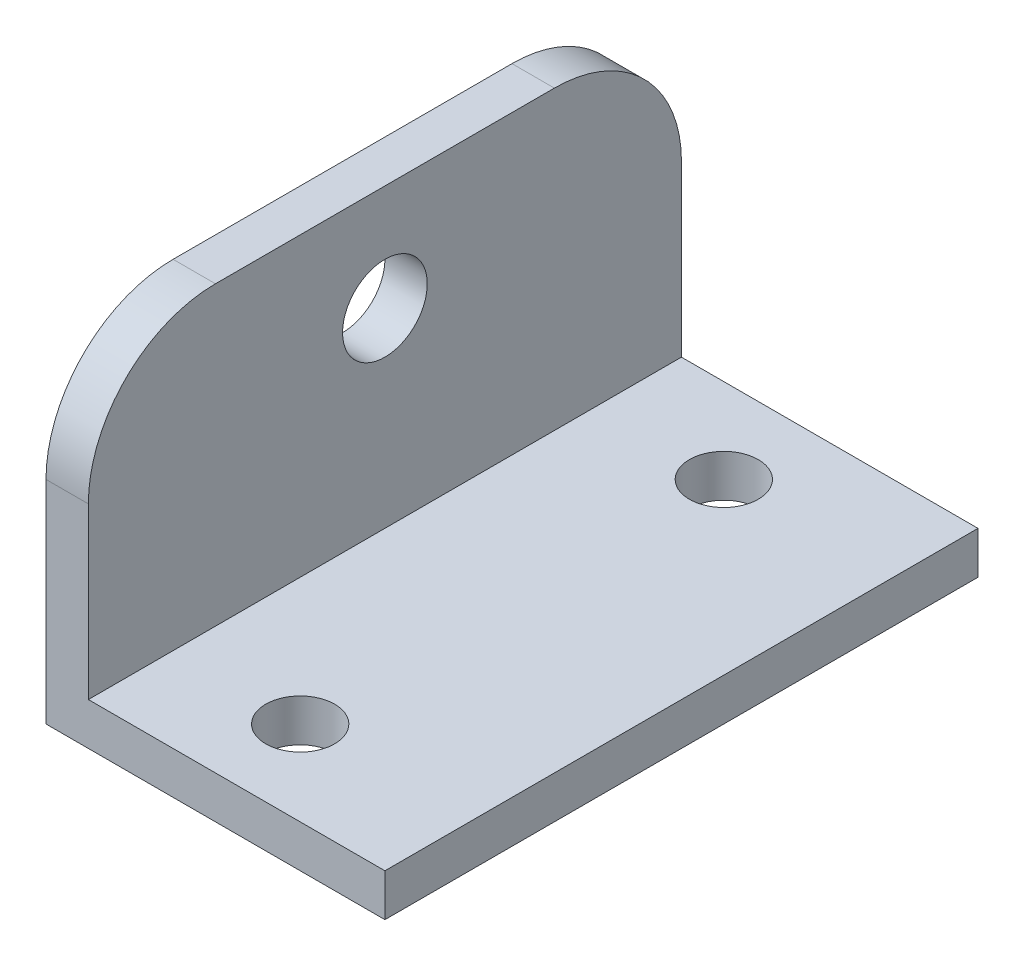
ISO-10303-21;
HEADER;
FILE_DESCRIPTION(('STEP AP214'),'2;1');
FILE_NAME('part.step','',(''),(''),'','','');
FILE_SCHEMA(('AUTOMOTIVE_DESIGN { 1 0 10303 214 1 1 1 1 }'));
ENDSEC;
DATA;
#1=APPLICATION_CONTEXT('core data for automotive mechanical design processes');
#2=APPLICATION_PROTOCOL_DEFINITION('international standard','automotive_design',2000,#1);
#3=PRODUCT_CONTEXT('',#1,'mechanical');
#4=PRODUCT('Part','Part','',(#3));
#5=PRODUCT_RELATED_PRODUCT_CATEGORY('part','',(#4));
#6=PRODUCT_DEFINITION_FORMATION('','',#4);
#7=PRODUCT_DEFINITION_CONTEXT('part definition',#1,'design');
#8=PRODUCT_DEFINITION('design','',#6,#7);
#9=PRODUCT_DEFINITION_SHAPE('','',#8);
#10=(LENGTH_UNIT() NAMED_UNIT(*) SI_UNIT(.MILLI.,.METRE.));
#11=(NAMED_UNIT(*) PLANE_ANGLE_UNIT() SI_UNIT($,.RADIAN.));
#12=(NAMED_UNIT(*) SI_UNIT($,.STERADIAN.) SOLID_ANGLE_UNIT());
#13=UNCERTAINTY_MEASURE_WITH_UNIT(LENGTH_MEASURE(1.E-05),#10,'distance_accuracy_value','');
#14=(GEOMETRIC_REPRESENTATION_CONTEXT(3) GLOBAL_UNCERTAINTY_ASSIGNED_CONTEXT((#13)) GLOBAL_UNIT_ASSIGNED_CONTEXT((#10,
#11,#12)) REPRESENTATION_CONTEXT('',''));
#15=CARTESIAN_POINT('',(0.,0.,0.));
#16=DIRECTION('',(0.,0.,1.));
#17=DIRECTION('',(1.,0.,0.));
#18=AXIS2_PLACEMENT_3D('',#15,#16,#17);
#19=CARTESIAN_POINT('',(0.,0.,44.45));
#20=DIRECTION('',(0.,1.,0.));
#21=DIRECTION('',(0.,0.,1.));
#22=AXIS2_PLACEMENT_3D('',#19,#20,#21);
#23=PLANE('',#22);
#24=CARTESIAN_POINT('',(12.7,0.,38.1));
#25=DIRECTION('',(0.,-1.,0.));
#26=DIRECTION('',(0.,0.,-1.));
#27=AXIS2_PLACEMENT_3D('',#24,#25,#26);
#28=CIRCLE('',#27,2.5796875);
#29=CARTESIAN_POINT('',(12.7,0.,35.5203125));
#30=VERTEX_POINT('',#29);
#31=EDGE_CURVE('E195',#30,#30,#28,.T.);
#32=ORIENTED_EDGE('',*,*,#31,.F.);
#33=EDGE_LOOP('',(#32));
#34=FACE_BOUND('',#33,.T.);
#35=CARTESIAN_POINT('',(12.7,0.,6.35));
#36=DIRECTION('',(0.,-1.,0.));
#37=DIRECTION('',(0.,0.,-1.));
#38=AXIS2_PLACEMENT_3D('',#35,#36,#37);
#39=CIRCLE('',#38,2.5796875);
#40=CARTESIAN_POINT('',(12.7,0.,3.7703125));
#41=VERTEX_POINT('',#40);
#42=EDGE_CURVE('E189',#41,#41,#39,.T.);
#43=ORIENTED_EDGE('',*,*,#42,.F.);
#44=EDGE_LOOP('',(#43));
#45=FACE_BOUND('',#44,.T.);
#46=DIRECTION('',(1.,0.,0.));
#47=VECTOR('',#46,1.);
#48=CARTESIAN_POINT('',(0.,0.,0.));
#49=LINE('',#48,#47);
#50=CARTESIAN_POINT('',(0.,0.,0.));
#51=VERTEX_POINT('',#50);
#52=CARTESIAN_POINT('',(25.4,0.,0.));
#53=VERTEX_POINT('',#52);
#54=EDGE_CURVE('E127',#51,#53,#49,.T.);
#55=ORIENTED_EDGE('',*,*,#54,.T.);
#56=DIRECTION('',(0.,0.,-1.));
#57=VECTOR('',#56,1.);
#58=CARTESIAN_POINT('',(25.4,0.,44.45));
#59=LINE('',#58,#57);
#60=CARTESIAN_POINT('',(25.4,0.,44.45));
#61=VERTEX_POINT('',#60);
#62=EDGE_CURVE('E108',#61,#53,#59,.T.);
#63=ORIENTED_EDGE('',*,*,#62,.F.);
#64=DIRECTION('',(1.,0.,0.));
#65=VECTOR('',#64,1.);
#66=CARTESIAN_POINT('',(0.,0.,44.45));
#67=LINE('',#66,#65);
#68=CARTESIAN_POINT('',(0.,0.,44.45));
#69=VERTEX_POINT('',#68);
#70=EDGE_CURVE('E115',#69,#61,#67,.T.);
#71=ORIENTED_EDGE('',*,*,#70,.F.);
#72=DIRECTION('',(0.,0.,-1.));
#73=VECTOR('',#72,1.);
#74=CARTESIAN_POINT('',(0.,0.,44.45));
#75=LINE('',#74,#73);
#76=EDGE_CURVE('E167',#69,#51,#75,.T.);
#77=ORIENTED_EDGE('',*,*,#76,.T.);
#78=EDGE_LOOP('',(#55,#63,#71,#77));
#79=FACE_BOUND('',#78,.T.);
#80=ADVANCED_FACE('F35',(#34,#45,#79),#23,.F.);
#81=CARTESIAN_POINT('',(25.4,0.,44.45));
#82=DIRECTION('',(-1.,0.,0.));
#83=DIRECTION('',(0.,0.,1.));
#84=AXIS2_PLACEMENT_3D('',#81,#82,#83);
#85=PLANE('',#84);
#86=DIRECTION('',(0.,1.,0.));
#87=VECTOR('',#86,1.);
#88=CARTESIAN_POINT('',(25.4,0.,0.));
#89=LINE('',#88,#87);
#90=CARTESIAN_POINT('',(25.4,3.175,0.));
#91=VERTEX_POINT('',#90);
#92=EDGE_CURVE('E173',#53,#91,#89,.T.);
#93=ORIENTED_EDGE('',*,*,#92,.T.);
#94=DIRECTION('',(0.,0.,-1.));
#95=VECTOR('',#94,1.);
#96=CARTESIAN_POINT('',(25.4,3.175,44.45));
#97=LINE('',#96,#95);
#98=CARTESIAN_POINT('',(25.4,3.175,44.45));
#99=VERTEX_POINT('',#98);
#100=EDGE_CURVE('E111',#99,#91,#97,.T.);
#101=ORIENTED_EDGE('',*,*,#100,.F.);
#102=DIRECTION('',(0.,1.,0.));
#103=VECTOR('',#102,1.);
#104=CARTESIAN_POINT('',(25.4,0.,44.45));
#105=LINE('',#104,#103);
#106=EDGE_CURVE('E104',#61,#99,#105,.T.);
#107=ORIENTED_EDGE('',*,*,#106,.F.);
#108=ORIENTED_EDGE('',*,*,#62,.T.);
#109=EDGE_LOOP('',(#93,#101,#107,#108));
#110=FACE_BOUND('',#109,.T.);
#111=ADVANCED_FACE('F106',(#110),#85,.F.);
#112=CARTESIAN_POINT('',(3.175,3.175,44.45));
#113=DIRECTION('',(0.,-1.,0.));
#114=DIRECTION('',(0.,0.,-1.));
#115=AXIS2_PLACEMENT_3D('',#112,#113,#114);
#116=PLANE('',#115);
#117=CARTESIAN_POINT('',(12.7,3.175,38.1));
#118=DIRECTION('',(0.,-1.,0.));
#119=DIRECTION('',(0.,0.,-1.));
#120=AXIS2_PLACEMENT_3D('',#117,#118,#119);
#121=CIRCLE('',#120,2.5796875);
#122=CARTESIAN_POINT('',(12.7,3.175,35.5203125));
#123=VERTEX_POINT('',#122);
#124=EDGE_CURVE('E192',#123,#123,#121,.T.);
#125=ORIENTED_EDGE('',*,*,#124,.T.);
#126=EDGE_LOOP('',(#125));
#127=FACE_BOUND('',#126,.T.);
#128=CARTESIAN_POINT('',(12.7,3.175,6.35));
#129=DIRECTION('',(0.,-1.,0.));
#130=DIRECTION('',(0.,0.,-1.));
#131=AXIS2_PLACEMENT_3D('',#128,#129,#130);
#132=CIRCLE('',#131,2.5796875);
#133=CARTESIAN_POINT('',(12.7,3.175,3.7703125));
#134=VERTEX_POINT('',#133);
#135=EDGE_CURVE('E186',#134,#134,#132,.T.);
#136=ORIENTED_EDGE('',*,*,#135,.T.);
#137=EDGE_LOOP('',(#136));
#138=FACE_BOUND('',#137,.T.);
#139=DIRECTION('',(-1.,0.,0.));
#140=VECTOR('',#139,1.);
#141=CARTESIAN_POINT('',(3.175,3.175,0.));
#142=LINE('',#141,#140);
#143=CARTESIAN_POINT('',(3.175,3.175,0.));
#144=VERTEX_POINT('',#143);
#145=EDGE_CURVE('E163',#91,#144,#142,.T.);
#146=ORIENTED_EDGE('',*,*,#145,.T.);
#147=DIRECTION('',(0.,0.,-1.));
#148=VECTOR('',#147,1.);
#149=CARTESIAN_POINT('',(3.175,3.175,44.45));
#150=LINE('',#149,#148);
#151=CARTESIAN_POINT('',(3.175,3.175,44.45));
#152=VERTEX_POINT('',#151);
#153=EDGE_CURVE('E132',#152,#144,#150,.T.);
#154=ORIENTED_EDGE('',*,*,#153,.F.);
#155=DIRECTION('',(-1.,0.,0.));
#156=VECTOR('',#155,1.);
#157=CARTESIAN_POINT('',(3.175,3.175,44.45));
#158=LINE('',#157,#156);
#159=EDGE_CURVE('E114',#99,#152,#158,.T.);
#160=ORIENTED_EDGE('',*,*,#159,.F.);
#161=ORIENTED_EDGE('',*,*,#100,.T.);
#162=EDGE_LOOP('',(#146,#154,#160,#161));
#163=FACE_BOUND('',#162,.T.);
#164=ADVANCED_FACE('F213',(#127,#138,#163),#116,.F.);
#165=CARTESIAN_POINT('',(3.175,3.175,44.45));
#166=DIRECTION('',(-1.,0.,0.));
#167=DIRECTION('',(0.,0.,1.));
#168=AXIS2_PLACEMENT_3D('',#165,#166,#167);
#169=PLANE('',#168);
#170=CARTESIAN_POINT('',(3.175,17.4625,22.225));
#171=DIRECTION('',(-1.,0.,0.));
#172=DIRECTION('',(0.,0.,1.));
#173=AXIS2_PLACEMENT_3D('',#170,#171,#172);
#174=CIRCLE('',#173,3.17499999999999);
#175=CARTESIAN_POINT('',(3.175,17.4625,25.4));
#176=VERTEX_POINT('',#175);
#177=EDGE_CURVE('E177',#176,#176,#174,.T.);
#178=ORIENTED_EDGE('',*,*,#177,.T.);
#179=EDGE_LOOP('',(#178));
#180=FACE_BOUND('',#179,.T.);
#181=DIRECTION('',(0.,1.,0.));
#182=VECTOR('',#181,1.);
#183=CARTESIAN_POINT('',(3.175,3.175,0.));
#184=LINE('',#183,#182);
#185=CARTESIAN_POINT('',(3.175,15.875,0.));
#186=VERTEX_POINT('',#185);
#187=EDGE_CURVE('E148',#144,#186,#184,.T.);
#188=ORIENTED_EDGE('',*,*,#187,.T.);
#189=CARTESIAN_POINT('',(3.175,15.875,9.525));
#190=DIRECTION('',(-1.,0.,0.));
#191=DIRECTION('',(0.,0.,1.));
#192=AXIS2_PLACEMENT_3D('',#189,#190,#191);
#193=CIRCLE('',#192,9.525);
#194=CARTESIAN_POINT('',(3.175,25.4,9.525));
#195=VERTEX_POINT('',#194);
#196=EDGE_CURVE('E43',#186,#195,#193,.F.);
#197=ORIENTED_EDGE('',*,*,#196,.T.);
#198=DIRECTION('',(0.,0.,-1.));
#199=VECTOR('',#198,1.);
#200=CARTESIAN_POINT('',(3.175,25.4,44.45));
#201=LINE('',#200,#199);
#202=CARTESIAN_POINT('',(3.175,25.4,34.925));
#203=VERTEX_POINT('',#202);
#204=EDGE_CURVE('E146',#203,#195,#201,.T.);
#205=ORIENTED_EDGE('',*,*,#204,.F.);
#206=CARTESIAN_POINT('',(3.175,15.875,34.925));
#207=DIRECTION('',(-1.,0.,0.));
#208=DIRECTION('',(0.,0.,1.));
#209=AXIS2_PLACEMENT_3D('',#206,#207,#208);
#210=CIRCLE('',#209,9.525);
#211=CARTESIAN_POINT('',(3.175,15.875,44.45));
#212=VERTEX_POINT('',#211);
#213=EDGE_CURVE('E50',#203,#212,#210,.F.);
#214=ORIENTED_EDGE('',*,*,#213,.T.);
#215=DIRECTION('',(0.,1.,0.));
#216=VECTOR('',#215,1.);
#217=CARTESIAN_POINT('',(3.175,3.175,44.45));
#218=LINE('',#217,#216);
#219=EDGE_CURVE('E170',#152,#212,#218,.T.);
#220=ORIENTED_EDGE('',*,*,#219,.F.);
#221=ORIENTED_EDGE('',*,*,#153,.T.);
#222=EDGE_LOOP('',(#188,#197,#205,#214,#220,#221));
#223=FACE_BOUND('',#222,.T.);
#224=ADVANCED_FACE('F145',(#180,#223),#169,.F.);
#225=CARTESIAN_POINT('',(0.,25.4,44.45));
#226=DIRECTION('',(0.,-1.,0.));
#227=DIRECTION('',(0.,0.,-1.));
#228=AXIS2_PLACEMENT_3D('',#225,#226,#227);
#229=PLANE('',#228);
#230=ORIENTED_EDGE('',*,*,#204,.T.);
#231=DIRECTION('',(-1.,0.,0.));
#232=VECTOR('',#231,1.);
#233=CARTESIAN_POINT('',(0.,25.4,9.525));
#234=LINE('',#233,#232);
#235=CARTESIAN_POINT('',(0.,25.4,9.525));
#236=VERTEX_POINT('',#235);
#237=EDGE_CURVE('E130',#195,#236,#234,.T.);
#238=ORIENTED_EDGE('',*,*,#237,.T.);
#239=DIRECTION('',(0.,0.,-1.));
#240=VECTOR('',#239,1.);
#241=CARTESIAN_POINT('',(0.,25.4,44.45));
#242=LINE('',#241,#240);
#243=CARTESIAN_POINT('',(0.,25.4,34.925));
#244=VERTEX_POINT('',#243);
#245=EDGE_CURVE('E156',#244,#236,#242,.T.);
#246=ORIENTED_EDGE('',*,*,#245,.F.);
#247=DIRECTION('',(-1.,0.,0.));
#248=VECTOR('',#247,1.);
#249=CARTESIAN_POINT('',(3.175,25.4,34.925));
#250=LINE('',#249,#248);
#251=EDGE_CURVE('E128',#244,#203,#250,.F.);
#252=ORIENTED_EDGE('',*,*,#251,.T.);
#253=EDGE_LOOP('',(#230,#238,#246,#252));
#254=FACE_BOUND('',#253,.T.);
#255=ADVANCED_FACE('F152',(#254),#229,.F.);
#256=CARTESIAN_POINT('',(0.,0.,44.45));
#257=DIRECTION('',(1.,0.,0.));
#258=DIRECTION('',(0.,0.,-1.));
#259=AXIS2_PLACEMENT_3D('',#256,#257,#258);
#260=PLANE('',#259);
#261=CARTESIAN_POINT('',(0.,17.4625,22.225));
#262=DIRECTION('',(-1.,0.,0.));
#263=DIRECTION('',(0.,0.,1.));
#264=AXIS2_PLACEMENT_3D('',#261,#262,#263);
#265=CIRCLE('',#264,3.17499999999999);
#266=CARTESIAN_POINT('',(0.,17.4625,25.4));
#267=VERTEX_POINT('',#266);
#268=EDGE_CURVE('E183',#267,#267,#265,.T.);
#269=ORIENTED_EDGE('',*,*,#268,.F.);
#270=EDGE_LOOP('',(#269));
#271=FACE_BOUND('',#270,.T.);
#272=ORIENTED_EDGE('',*,*,#245,.T.);
#273=CARTESIAN_POINT('',(0.,15.875,9.525));
#274=DIRECTION('',(1.,0.,0.));
#275=DIRECTION('',(0.,0.,-1.));
#276=AXIS2_PLACEMENT_3D('',#273,#274,#275);
#277=CIRCLE('',#276,9.525);
#278=CARTESIAN_POINT('',(0.,15.875,0.));
#279=VERTEX_POINT('',#278);
#280=EDGE_CURVE('E140',#236,#279,#277,.F.);
#281=ORIENTED_EDGE('',*,*,#280,.T.);
#282=DIRECTION('',(0.,-1.,0.));
#283=VECTOR('',#282,1.);
#284=CARTESIAN_POINT('',(0.,0.,0.));
#285=LINE('',#284,#283);
#286=EDGE_CURVE('E124',#279,#51,#285,.T.);
#287=ORIENTED_EDGE('',*,*,#286,.T.);
#288=ORIENTED_EDGE('',*,*,#76,.F.);
#289=DIRECTION('',(0.,-1.,0.));
#290=VECTOR('',#289,1.);
#291=CARTESIAN_POINT('',(0.,0.,44.45));
#292=LINE('',#291,#290);
#293=CARTESIAN_POINT('',(0.,15.875,44.45));
#294=VERTEX_POINT('',#293);
#295=EDGE_CURVE('E120',#294,#69,#292,.T.);
#296=ORIENTED_EDGE('',*,*,#295,.F.);
#297=CARTESIAN_POINT('',(0.,15.875,34.925));
#298=DIRECTION('',(1.,0.,0.));
#299=DIRECTION('',(0.,0.,-1.));
#300=AXIS2_PLACEMENT_3D('',#297,#298,#299);
#301=CIRCLE('',#300,9.525);
#302=EDGE_CURVE('E138',#294,#244,#301,.F.);
#303=ORIENTED_EDGE('',*,*,#302,.T.);
#304=EDGE_LOOP('',(#272,#281,#287,#288,#296,#303));
#305=FACE_BOUND('',#304,.T.);
#306=ADVANCED_FACE('F160',(#271,#305),#260,.F.);
#307=CARTESIAN_POINT('',(0.,0.,44.45));
#308=DIRECTION('',(0.,0.,1.));
#309=DIRECTION('',(1.,0.,0.));
#310=AXIS2_PLACEMENT_3D('',#307,#308,#309);
#311=PLANE('',#310);
#312=ORIENTED_EDGE('',*,*,#219,.T.);
#313=DIRECTION('',(-1.,0.,0.));
#314=VECTOR('',#313,1.);
#315=CARTESIAN_POINT('',(0.,15.875,44.45));
#316=LINE('',#315,#314);
#317=EDGE_CURVE('E11',#212,#294,#316,.T.);
#318=ORIENTED_EDGE('',*,*,#317,.T.);
#319=ORIENTED_EDGE('',*,*,#295,.T.);
#320=ORIENTED_EDGE('',*,*,#70,.T.);
#321=ORIENTED_EDGE('',*,*,#106,.T.);
#322=ORIENTED_EDGE('',*,*,#159,.T.);
#323=EDGE_LOOP('',(#312,#318,#319,#320,#321,#322));
#324=FACE_BOUND('',#323,.T.);
#325=ADVANCED_FACE('F118',(#324),#311,.T.);
#326=CARTESIAN_POINT('',(0.,0.,0.));
#327=DIRECTION('',(0.,0.,1.));
#328=DIRECTION('',(1.,0.,0.));
#329=AXIS2_PLACEMENT_3D('',#326,#327,#328);
#330=PLANE('',#329);
#331=ORIENTED_EDGE('',*,*,#286,.F.);
#332=DIRECTION('',(-1.,0.,0.));
#333=VECTOR('',#332,1.);
#334=CARTESIAN_POINT('',(0.,15.875,0.));
#335=LINE('',#334,#333);
#336=EDGE_CURVE('E58',#279,#186,#335,.F.);
#337=ORIENTED_EDGE('',*,*,#336,.T.);
#338=ORIENTED_EDGE('',*,*,#187,.F.);
#339=ORIENTED_EDGE('',*,*,#145,.F.);
#340=ORIENTED_EDGE('',*,*,#92,.F.);
#341=ORIENTED_EDGE('',*,*,#54,.F.);
#342=EDGE_LOOP('',(#331,#337,#338,#339,#340,#341));
#343=FACE_BOUND('',#342,.T.);
#344=ADVANCED_FACE('F161',(#343),#330,.F.);
#345=CARTESIAN_POINT('',(0.,17.4625,22.225));
#346=DIRECTION('',(-1.,0.,0.));
#347=DIRECTION('',(0.,0.,1.));
#348=AXIS2_PLACEMENT_3D('',#345,#346,#347);
#349=CYLINDRICAL_SURFACE('',#348,3.17499999999999);
#350=ORIENTED_EDGE('',*,*,#268,.T.);
#351=EDGE_LOOP('',(#350));
#352=FACE_BOUND('',#351,.T.);
#353=ORIENTED_EDGE('',*,*,#177,.F.);
#354=EDGE_LOOP('',(#353));
#355=FACE_BOUND('',#354,.T.);
#356=ADVANCED_FACE('F226',(#352,#355),#349,.F.);
#357=CARTESIAN_POINT('',(0.,15.875,9.525));
#358=DIRECTION('',(-1.,0.,0.));
#359=DIRECTION('',(0.,0.,1.));
#360=AXIS2_PLACEMENT_3D('',#357,#358,#359);
#361=CYLINDRICAL_SURFACE('',#360,9.525);
#362=ORIENTED_EDGE('',*,*,#196,.F.);
#363=ORIENTED_EDGE('',*,*,#336,.F.);
#364=ORIENTED_EDGE('',*,*,#280,.F.);
#365=ORIENTED_EDGE('',*,*,#237,.F.);
#366=EDGE_LOOP('',(#362,#363,#364,#365));
#367=FACE_BOUND('',#366,.T.);
#368=ADVANCED_FACE('F158',(#367),#361,.T.);
#369=CARTESIAN_POINT('',(0.,15.875,34.925));
#370=DIRECTION('',(1.,0.,0.));
#371=DIRECTION('',(0.,0.,-1.));
#372=AXIS2_PLACEMENT_3D('',#369,#370,#371);
#373=CYLINDRICAL_SURFACE('',#372,9.525);
#374=ORIENTED_EDGE('',*,*,#213,.F.);
#375=ORIENTED_EDGE('',*,*,#251,.F.);
#376=ORIENTED_EDGE('',*,*,#302,.F.);
#377=ORIENTED_EDGE('',*,*,#317,.F.);
#378=EDGE_LOOP('',(#374,#375,#376,#377));
#379=FACE_BOUND('',#378,.T.);
#380=ADVANCED_FACE('F37',(#379),#373,.T.);
#381=CARTESIAN_POINT('',(12.7,0.,6.35));
#382=DIRECTION('',(0.,-1.,0.));
#383=DIRECTION('',(0.,0.,-1.));
#384=AXIS2_PLACEMENT_3D('',#381,#382,#383);
#385=CYLINDRICAL_SURFACE('',#384,2.5796875);
#386=ORIENTED_EDGE('',*,*,#42,.T.);
#387=EDGE_LOOP('',(#386));
#388=FACE_BOUND('',#387,.T.);
#389=ORIENTED_EDGE('',*,*,#135,.F.);
#390=EDGE_LOOP('',(#389));
#391=FACE_BOUND('',#390,.T.);
#392=ADVANCED_FACE('F207',(#388,#391),#385,.F.);
#393=CARTESIAN_POINT('',(12.7,0.,38.1));
#394=DIRECTION('',(0.,-1.,0.));
#395=DIRECTION('',(0.,0.,-1.));
#396=AXIS2_PLACEMENT_3D('',#393,#394,#395);
#397=CYLINDRICAL_SURFACE('',#396,2.5796875);
#398=ORIENTED_EDGE('',*,*,#31,.T.);
#399=EDGE_LOOP('',(#398));
#400=FACE_BOUND('',#399,.T.);
#401=ORIENTED_EDGE('',*,*,#124,.F.);
#402=EDGE_LOOP('',(#401));
#403=FACE_BOUND('',#402,.T.);
#404=ADVANCED_FACE('F199',(#400,#403),#397,.F.);
#405=CLOSED_SHELL('',(#80,#111,#164,#224,#255,#306,#325,#344,#356,#368,#380,#392,#404));
#406=MANIFOLD_SOLID_BREP('B2',#405);
#407=ADVANCED_BREP_SHAPE_REPRESENTATION('',(#18,#406),#14);
#408=SHAPE_DEFINITION_REPRESENTATION(#9,#407);
ENDSEC;
END-ISO-10303-21;
